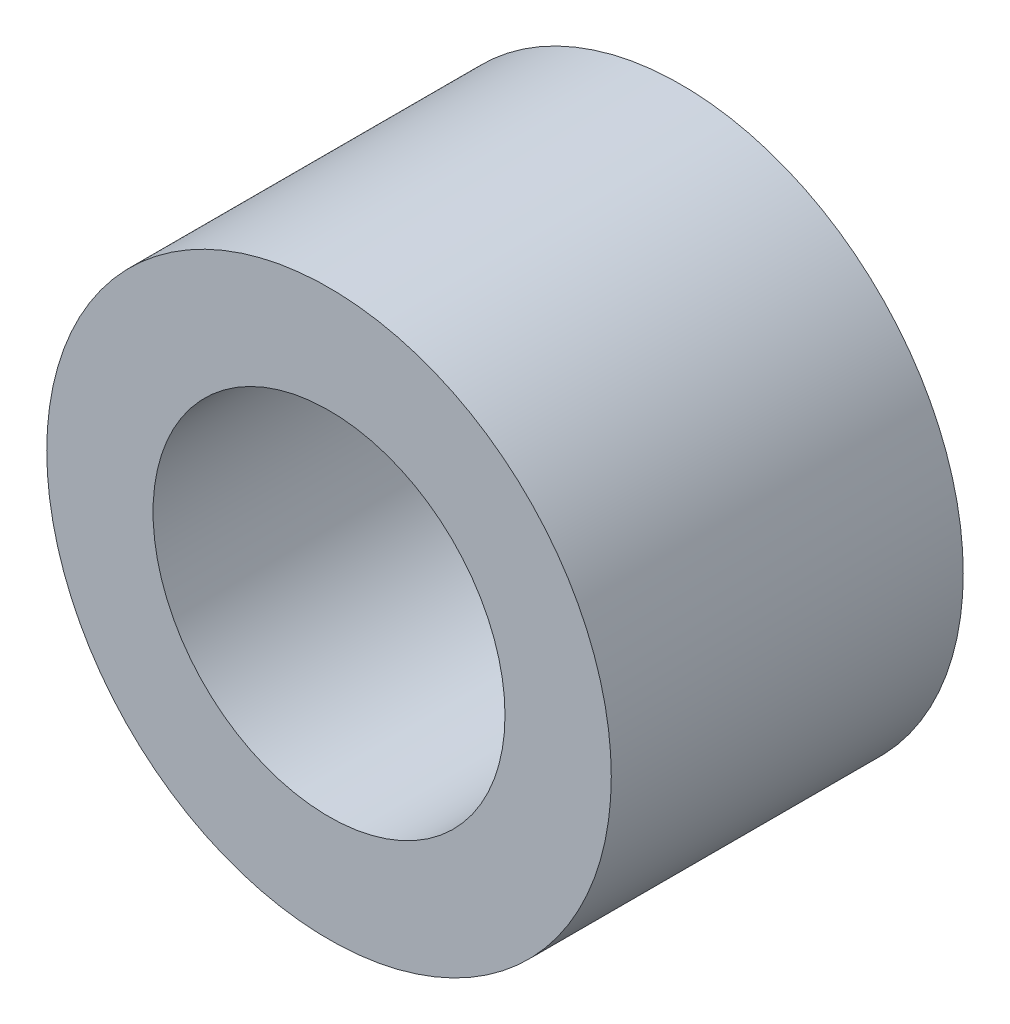
ISO-10303-21;
HEADER;
FILE_DESCRIPTION(('STEP AP214'),'2;1');
FILE_NAME('part.step','',(''),(''),'','','');
FILE_SCHEMA(('AUTOMOTIVE_DESIGN { 1 0 10303 214 1 1 1 1 }'));
ENDSEC;
DATA;
#1=APPLICATION_CONTEXT('core data for automotive mechanical design processes');
#2=APPLICATION_PROTOCOL_DEFINITION('international standard','automotive_design',2000,#1);
#3=PRODUCT_CONTEXT('',#1,'mechanical');
#4=PRODUCT('Part','Part','',(#3));
#5=PRODUCT_RELATED_PRODUCT_CATEGORY('part','',(#4));
#6=PRODUCT_DEFINITION_FORMATION('','',#4);
#7=PRODUCT_DEFINITION_CONTEXT('part definition',#1,'design');
#8=PRODUCT_DEFINITION('design','',#6,#7);
#9=PRODUCT_DEFINITION_SHAPE('','',#8);
#10=(LENGTH_UNIT() NAMED_UNIT(*) SI_UNIT(.MILLI.,.METRE.));
#11=(NAMED_UNIT(*) PLANE_ANGLE_UNIT() SI_UNIT($,.RADIAN.));
#12=(NAMED_UNIT(*) SI_UNIT($,.STERADIAN.) SOLID_ANGLE_UNIT());
#13=UNCERTAINTY_MEASURE_WITH_UNIT(LENGTH_MEASURE(1.E-05),#10,'distance_accuracy_value','');
#14=(GEOMETRIC_REPRESENTATION_CONTEXT(3) GLOBAL_UNCERTAINTY_ASSIGNED_CONTEXT((#13)) GLOBAL_UNIT_ASSIGNED_CONTEXT((#10,
#11,#12)) REPRESENTATION_CONTEXT('',''));
#15=CARTESIAN_POINT('',(0.,0.,0.));
#16=DIRECTION('',(0.,0.,1.));
#17=DIRECTION('',(1.,0.,0.));
#18=AXIS2_PLACEMENT_3D('',#15,#16,#17);
#19=CARTESIAN_POINT('',(0.,0.,2.5));
#20=DIRECTION('',(0.,0.,1.));
#21=DIRECTION('',(1.,0.,0.));
#22=AXIS2_PLACEMENT_3D('',#19,#20,#21);
#23=PLANE('',#22);
#24=CARTESIAN_POINT('',(0.,0.,2.5));
#25=DIRECTION('',(0.,0.,1.));
#26=DIRECTION('',(1.,0.,0.));
#27=AXIS2_PLACEMENT_3D('',#24,#25,#26);
#28=CIRCLE('',#27,4.01);
#29=CARTESIAN_POINT('',(4.01,0.,2.5));
#30=VERTEX_POINT('',#29);
#31=EDGE_CURVE('E10',#30,#30,#28,.T.);
#32=ORIENTED_EDGE('',*,*,#31,.T.);
#33=EDGE_LOOP('',(#32));
#34=FACE_BOUND('',#33,.T.);
#35=CARTESIAN_POINT('',(0.,0.,2.5));
#36=DIRECTION('',(0.,0.,1.));
#37=DIRECTION('',(1.,0.,0.));
#38=AXIS2_PLACEMENT_3D('',#35,#36,#37);
#39=CIRCLE('',#38,2.5);
#40=CARTESIAN_POINT('',(2.5,0.,2.5));
#41=VERTEX_POINT('',#40);
#42=EDGE_CURVE('E41',#41,#41,#39,.T.);
#43=ORIENTED_EDGE('',*,*,#42,.F.);
#44=EDGE_LOOP('',(#43));
#45=FACE_BOUND('',#44,.T.);
#46=ADVANCED_FACE('F30',(#34,#45),#23,.T.);
#47=CARTESIAN_POINT('',(0.,0.,-2.5));
#48=DIRECTION('',(0.,0.,1.));
#49=DIRECTION('',(1.,0.,0.));
#50=AXIS2_PLACEMENT_3D('',#47,#48,#49);
#51=PLANE('',#50);
#52=CARTESIAN_POINT('',(0.,0.,-2.5));
#53=DIRECTION('',(0.,0.,1.));
#54=DIRECTION('',(1.,0.,0.));
#55=AXIS2_PLACEMENT_3D('',#52,#53,#54);
#56=CIRCLE('',#55,4.01);
#57=CARTESIAN_POINT('',(4.01,0.,-2.5));
#58=VERTEX_POINT('',#57);
#59=EDGE_CURVE('E34',#58,#58,#56,.T.);
#60=ORIENTED_EDGE('',*,*,#59,.F.);
#61=EDGE_LOOP('',(#60));
#62=FACE_BOUND('',#61,.T.);
#63=CARTESIAN_POINT('',(0.,0.,-2.5));
#64=DIRECTION('',(0.,0.,1.));
#65=DIRECTION('',(1.,0.,0.));
#66=AXIS2_PLACEMENT_3D('',#63,#64,#65);
#67=CIRCLE('',#66,2.5);
#68=CARTESIAN_POINT('',(2.5,0.,-2.5));
#69=VERTEX_POINT('',#68);
#70=EDGE_CURVE('E43',#69,#69,#67,.T.);
#71=ORIENTED_EDGE('',*,*,#70,.T.);
#72=EDGE_LOOP('',(#71));
#73=FACE_BOUND('',#72,.T.);
#74=ADVANCED_FACE('F53',(#62,#73),#51,.F.);
#75=CARTESIAN_POINT('',(0.,0.,2.5));
#76=DIRECTION('',(0.,0.,-1.));
#77=DIRECTION('',(-1.,0.,0.));
#78=AXIS2_PLACEMENT_3D('',#75,#76,#77);
#79=CYLINDRICAL_SURFACE('',#78,4.01);
#80=ORIENTED_EDGE('',*,*,#31,.F.);
#81=EDGE_LOOP('',(#80));
#82=FACE_BOUND('',#81,.T.);
#83=ORIENTED_EDGE('',*,*,#59,.T.);
#84=EDGE_LOOP('',(#83));
#85=FACE_BOUND('',#84,.T.);
#86=ADVANCED_FACE('F32',(#82,#85),#79,.T.);
#87=CARTESIAN_POINT('',(0.,0.,2.5));
#88=DIRECTION('',(0.,0.,-1.));
#89=DIRECTION('',(-1.,0.,0.));
#90=AXIS2_PLACEMENT_3D('',#87,#88,#89);
#91=CYLINDRICAL_SURFACE('',#90,2.5);
#92=ORIENTED_EDGE('',*,*,#42,.T.);
#93=EDGE_LOOP('',(#92));
#94=FACE_BOUND('',#93,.T.);
#95=ORIENTED_EDGE('',*,*,#70,.F.);
#96=EDGE_LOOP('',(#95));
#97=FACE_BOUND('',#96,.T.);
#98=ADVANCED_FACE('F49',(#94,#97),#91,.F.);
#99=CLOSED_SHELL('',(#46,#74,#86,#98));
#100=MANIFOLD_SOLID_BREP('B2',#99);
#101=ADVANCED_BREP_SHAPE_REPRESENTATION('',(#18,#100),#14);
#102=SHAPE_DEFINITION_REPRESENTATION(#9,#101);
ENDSEC;
END-ISO-10303-21;
